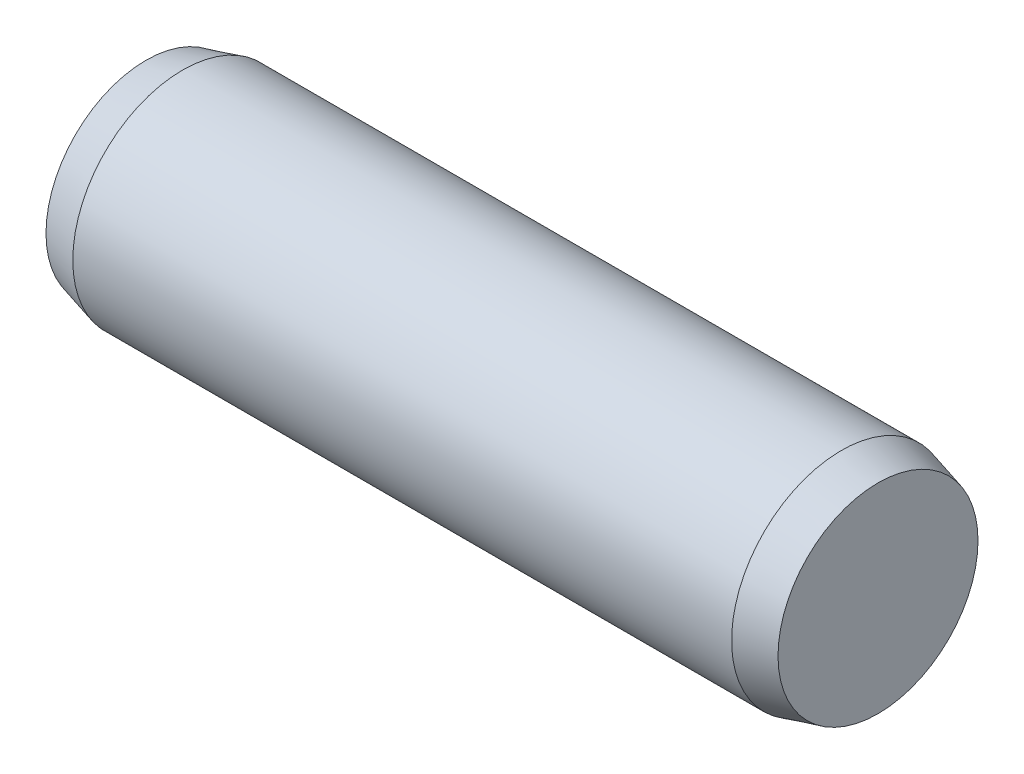
ISO-10303-21;
HEADER;
FILE_DESCRIPTION(('STEP AP214'),'2;1');
FILE_NAME('part.step','',(''),(''),'','','');
FILE_SCHEMA(('AUTOMOTIVE_DESIGN { 1 0 10303 214 1 1 1 1 }'));
ENDSEC;
DATA;
#1=APPLICATION_CONTEXT('core data for automotive mechanical design processes');
#2=APPLICATION_PROTOCOL_DEFINITION('international standard','automotive_design',2000,#1);
#3=PRODUCT_CONTEXT('',#1,'mechanical');
#4=PRODUCT('Part','Part','',(#3));
#5=PRODUCT_RELATED_PRODUCT_CATEGORY('part','',(#4));
#6=PRODUCT_DEFINITION_FORMATION('','',#4);
#7=PRODUCT_DEFINITION_CONTEXT('part definition',#1,'design');
#8=PRODUCT_DEFINITION('design','',#6,#7);
#9=PRODUCT_DEFINITION_SHAPE('','',#8);
#10=(LENGTH_UNIT() NAMED_UNIT(*) SI_UNIT(.MILLI.,.METRE.));
#11=(NAMED_UNIT(*) PLANE_ANGLE_UNIT() SI_UNIT($,.RADIAN.));
#12=(NAMED_UNIT(*) SI_UNIT($,.STERADIAN.) SOLID_ANGLE_UNIT());
#13=UNCERTAINTY_MEASURE_WITH_UNIT(LENGTH_MEASURE(1.E-05),#10,'distance_accuracy_value','');
#14=(GEOMETRIC_REPRESENTATION_CONTEXT(3) GLOBAL_UNCERTAINTY_ASSIGNED_CONTEXT((#13)) GLOBAL_UNIT_ASSIGNED_CONTEXT((#10,
#11,#12)) REPRESENTATION_CONTEXT('',''));
#15=CARTESIAN_POINT('',(0.,0.,0.));
#16=DIRECTION('',(0.,0.,1.));
#17=DIRECTION('',(1.,0.,0.));
#18=AXIS2_PLACEMENT_3D('',#15,#16,#17);
#19=CARTESIAN_POINT('',(-4.5,0.,0.));
#20=DIRECTION('',(1.,0.,0.));
#21=DIRECTION('',(0.,0.,-1.));
#22=AXIS2_PLACEMENT_3D('',#19,#20,#21);
#23=CYLINDRICAL_SURFACE('',#22,1.5);
#24=CARTESIAN_POINT('',(-4.5,0.,0.));
#25=DIRECTION('',(-1.,0.,0.));
#26=DIRECTION('',(0.,0.,1.));
#27=AXIS2_PLACEMENT_3D('',#24,#25,#26);
#28=CIRCLE('',#27,1.5);
#29=CARTESIAN_POINT('',(-4.5,0.,1.5));
#30=VERTEX_POINT('',#29);
#31=EDGE_CURVE('E46',#30,#30,#28,.T.);
#32=ORIENTED_EDGE('',*,*,#31,.F.);
#33=EDGE_LOOP('',(#32));
#34=FACE_BOUND('',#33,.T.);
#35=CARTESIAN_POINT('',(4.5,0.,0.));
#36=DIRECTION('',(1.,0.,0.));
#37=DIRECTION('',(0.,0.,-1.));
#38=AXIS2_PLACEMENT_3D('',#35,#36,#37);
#39=CIRCLE('',#38,1.5);
#40=CARTESIAN_POINT('',(4.5,0.,-1.5));
#41=VERTEX_POINT('',#40);
#42=EDGE_CURVE('E10',#41,#41,#39,.T.);
#43=ORIENTED_EDGE('',*,*,#42,.F.);
#44=EDGE_LOOP('',(#43));
#45=FACE_BOUND('',#44,.T.);
#46=ADVANCED_FACE('F32',(#34,#45),#23,.T.);
#47=CARTESIAN_POINT('',(4.5,0.,0.));
#48=DIRECTION('',(-1.,0.,0.));
#49=DIRECTION('',(0.,0.,-1.));
#50=AXIS2_PLACEMENT_3D('',#47,#48,#49);
#51=CONICAL_SURFACE('',#50,1.5,0.26179938779915);
#52=CARTESIAN_POINT('',(5.,0.,0.));
#53=DIRECTION('',(1.,0.,0.));
#54=DIRECTION('',(0.,0.,-1.));
#55=AXIS2_PLACEMENT_3D('',#52,#53,#54);
#56=CIRCLE('',#55,1.36602540378444);
#57=CARTESIAN_POINT('',(5.,0.,-1.36602540378444));
#58=VERTEX_POINT('',#57);
#59=EDGE_CURVE('E38',#58,#58,#56,.T.);
#60=ORIENTED_EDGE('',*,*,#59,.F.);
#61=EDGE_LOOP('',(#60));
#62=FACE_BOUND('',#61,.T.);
#63=ORIENTED_EDGE('',*,*,#42,.T.);
#64=EDGE_LOOP('',(#63));
#65=FACE_BOUND('',#64,.T.);
#66=ADVANCED_FACE('F56',(#62,#65),#51,.T.);
#67=CARTESIAN_POINT('',(5.,0.,0.));
#68=DIRECTION('',(1.,0.,0.));
#69=DIRECTION('',(0.,0.,-1.));
#70=AXIS2_PLACEMENT_3D('',#67,#68,#69);
#71=PLANE('',#70);
#72=ORIENTED_EDGE('',*,*,#59,.T.);
#73=EDGE_LOOP('',(#72));
#74=FACE_BOUND('',#73,.T.);
#75=ADVANCED_FACE('F60',(#74),#71,.T.);
#76=CARTESIAN_POINT('',(-4.5,0.,0.));
#77=DIRECTION('',(1.,0.,0.));
#78=DIRECTION('',(0.,0.,1.));
#79=AXIS2_PLACEMENT_3D('',#76,#77,#78);
#80=CONICAL_SURFACE('',#79,1.5,0.26179938779915);
#81=CARTESIAN_POINT('',(-5.,0.,0.));
#82=DIRECTION('',(-1.,0.,0.));
#83=DIRECTION('',(0.,0.,1.));
#84=AXIS2_PLACEMENT_3D('',#81,#82,#83);
#85=CIRCLE('',#84,1.36602540378444);
#86=CARTESIAN_POINT('',(-5.,0.,1.36602540378444));
#87=VERTEX_POINT('',#86);
#88=EDGE_CURVE('E42',#87,#87,#85,.T.);
#89=ORIENTED_EDGE('',*,*,#88,.F.);
#90=EDGE_LOOP('',(#89));
#91=FACE_BOUND('',#90,.T.);
#92=ORIENTED_EDGE('',*,*,#31,.T.);
#93=EDGE_LOOP('',(#92));
#94=FACE_BOUND('',#93,.T.);
#95=ADVANCED_FACE('F52',(#91,#94),#80,.T.);
#96=CARTESIAN_POINT('',(-5.,0.,0.));
#97=DIRECTION('',(-1.,0.,0.));
#98=DIRECTION('',(0.,0.,1.));
#99=AXIS2_PLACEMENT_3D('',#96,#97,#98);
#100=PLANE('',#99);
#101=ORIENTED_EDGE('',*,*,#88,.T.);
#102=EDGE_LOOP('',(#101));
#103=FACE_BOUND('',#102,.T.);
#104=ADVANCED_FACE('F69',(#103),#100,.T.);
#105=CLOSED_SHELL('',(#46,#66,#75,#95,#104));
#106=MANIFOLD_SOLID_BREP('B2',#105);
#107=ADVANCED_BREP_SHAPE_REPRESENTATION('',(#18,#106),#14);
#108=SHAPE_DEFINITION_REPRESENTATION(#9,#107);
ENDSEC;
END-ISO-10303-21;
